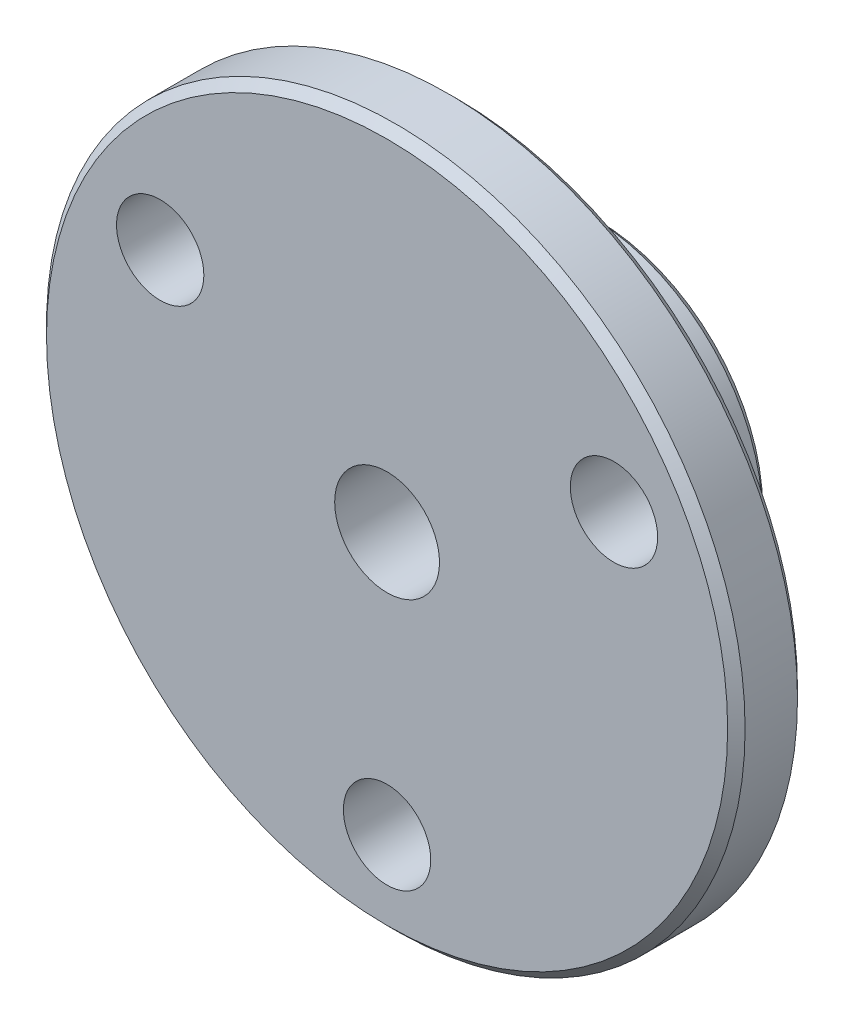
ISO-10303-21;
HEADER;
FILE_DESCRIPTION(('STEP AP214'),'2;1');
FILE_NAME('part.step','',(''),(''),'','','');
FILE_SCHEMA(('AUTOMOTIVE_DESIGN { 1 0 10303 214 1 1 1 1 }'));
ENDSEC;
DATA;
#1=APPLICATION_CONTEXT('core data for automotive mechanical design processes');
#2=APPLICATION_PROTOCOL_DEFINITION('international standard','automotive_design',2000,#1);
#3=PRODUCT_CONTEXT('',#1,'mechanical');
#4=PRODUCT('Part','Part','',(#3));
#5=PRODUCT_RELATED_PRODUCT_CATEGORY('part','',(#4));
#6=PRODUCT_DEFINITION_FORMATION('','',#4);
#7=PRODUCT_DEFINITION_CONTEXT('part definition',#1,'design');
#8=PRODUCT_DEFINITION('design','',#6,#7);
#9=PRODUCT_DEFINITION_SHAPE('','',#8);
#10=(LENGTH_UNIT() NAMED_UNIT(*) SI_UNIT(.MILLI.,.METRE.));
#11=(NAMED_UNIT(*) PLANE_ANGLE_UNIT() SI_UNIT($,.RADIAN.));
#12=(NAMED_UNIT(*) SI_UNIT($,.STERADIAN.) SOLID_ANGLE_UNIT());
#13=UNCERTAINTY_MEASURE_WITH_UNIT(LENGTH_MEASURE(1.E-05),#10,'distance_accuracy_value','');
#14=(GEOMETRIC_REPRESENTATION_CONTEXT(3) GLOBAL_UNCERTAINTY_ASSIGNED_CONTEXT((#13)) GLOBAL_UNIT_ASSIGNED_CONTEXT((#10,
#11,#12)) REPRESENTATION_CONTEXT('',''));
#15=CARTESIAN_POINT('',(0.,0.,0.));
#16=DIRECTION('',(0.,0.,1.));
#17=DIRECTION('',(1.,0.,0.));
#18=AXIS2_PLACEMENT_3D('',#15,#16,#17);
#19=CARTESIAN_POINT('',(0.,0.,-4.));
#20=DIRECTION('',(0.,0.,1.));
#21=DIRECTION('',(1.,0.,0.));
#22=AXIS2_PLACEMENT_3D('',#19,#20,#21);
#23=CYLINDRICAL_SURFACE('',#22,5.);
#24=CARTESIAN_POINT('',(0.,0.,-0.249999999999997));
#25=DIRECTION('',(0.,0.,1.));
#26=DIRECTION('',(1.,0.,0.));
#27=AXIS2_PLACEMENT_3D('',#24,#25,#26);
#28=CIRCLE('',#27,5.);
#29=CARTESIAN_POINT('',(5.,0.,-0.249999999999997));
#30=VERTEX_POINT('',#29);
#31=EDGE_CURVE('E52',#30,#30,#28,.F.);
#32=ORIENTED_EDGE('',*,*,#31,.T.);
#33=EDGE_LOOP('',(#32));
#34=FACE_BOUND('',#33,.T.);
#35=CARTESIAN_POINT('',(0.,0.,-3.75));
#36=DIRECTION('',(0.,0.,1.));
#37=DIRECTION('',(1.,0.,0.));
#38=AXIS2_PLACEMENT_3D('',#35,#36,#37);
#39=CIRCLE('',#38,5.);
#40=CARTESIAN_POINT('',(5.,0.,-3.75));
#41=VERTEX_POINT('',#40);
#42=EDGE_CURVE('E57',#41,#41,#39,.T.);
#43=ORIENTED_EDGE('',*,*,#42,.T.);
#44=EDGE_LOOP('',(#43));
#45=FACE_BOUND('',#44,.T.);
#46=ADVANCED_FACE('F43',(#34,#45),#23,.T.);
#47=CARTESIAN_POINT('',(0.,0.,-4.));
#48=DIRECTION('',(0.,0.,1.));
#49=DIRECTION('',(1.,0.,0.));
#50=AXIS2_PLACEMENT_3D('',#47,#48,#49);
#51=PLANE('',#50);
#52=CARTESIAN_POINT('',(0.,0.,-4.));
#53=DIRECTION('',(0.,0.,1.));
#54=DIRECTION('',(1.,0.,0.));
#55=AXIS2_PLACEMENT_3D('',#52,#53,#54);
#56=CIRCLE('',#55,4.75);
#57=CARTESIAN_POINT('',(4.75,0.,-4.));
#58=VERTEX_POINT('',#57);
#59=EDGE_CURVE('E10',#58,#58,#56,.F.);
#60=ORIENTED_EDGE('',*,*,#59,.T.);
#61=EDGE_LOOP('',(#60));
#62=FACE_BOUND('',#61,.T.);
#63=CARTESIAN_POINT('',(0.,0.,-4.));
#64=DIRECTION('',(0.,0.,-1.));
#65=DIRECTION('',(-1.,0.,0.));
#66=AXIS2_PLACEMENT_3D('',#63,#64,#65);
#67=CIRCLE('',#66,1.5);
#68=CARTESIAN_POINT('',(-1.5,0.,-4.));
#69=VERTEX_POINT('',#68);
#70=EDGE_CURVE('E109',#69,#69,#67,.T.);
#71=ORIENTED_EDGE('',*,*,#70,.F.);
#72=EDGE_LOOP('',(#71));
#73=FACE_BOUND('',#72,.T.);
#74=ADVANCED_FACE('F128',(#62,#73),#51,.F.);
#75=CARTESIAN_POINT('',(0.,0.,2.));
#76=DIRECTION('',(0.,0.,1.));
#77=DIRECTION('',(1.,0.,0.));
#78=AXIS2_PLACEMENT_3D('',#75,#76,#77);
#79=PLANE('',#78);
#80=CARTESIAN_POINT('',(0.,0.,2.));
#81=DIRECTION('',(0.,0.,1.));
#82=DIRECTION('',(1.,0.,0.));
#83=AXIS2_PLACEMENT_3D('',#80,#81,#82);
#84=CIRCLE('',#83,9.75000000000001);
#85=CARTESIAN_POINT('',(9.75000000000001,0.,2.));
#86=VERTEX_POINT('',#85);
#87=EDGE_CURVE('E80',#86,#86,#84,.T.);
#88=ORIENTED_EDGE('',*,*,#87,.T.);
#89=EDGE_LOOP('',(#88));
#90=FACE_BOUND('',#89,.T.);
#91=CARTESIAN_POINT('',(0.,0.,2.));
#92=DIRECTION('',(0.,0.,-1.));
#93=DIRECTION('',(-1.,0.,0.));
#94=AXIS2_PLACEMENT_3D('',#91,#92,#93);
#95=CIRCLE('',#94,1.5);
#96=CARTESIAN_POINT('',(-1.5,0.,2.));
#97=VERTEX_POINT('',#96);
#98=EDGE_CURVE('E105',#97,#97,#95,.T.);
#99=ORIENTED_EDGE('',*,*,#98,.T.);
#100=EDGE_LOOP('',(#99));
#101=FACE_BOUND('',#100,.T.);
#102=CARTESIAN_POINT('',(6.49519052838293,3.75000000000023,2.));
#103=DIRECTION('',(0.,0.,1.));
#104=DIRECTION('',(1.,0.,0.));
#105=AXIS2_PLACEMENT_3D('',#102,#103,#104);
#106=CIRCLE('',#105,1.25000000000019);
#107=CARTESIAN_POINT('',(7.74519052838312,3.75000000000023,2.));
#108=VERTEX_POINT('',#107);
#109=EDGE_CURVE('E89',#108,#108,#106,.T.);
#110=ORIENTED_EDGE('',*,*,#109,.F.);
#111=EDGE_LOOP('',(#110));
#112=FACE_BOUND('',#111,.T.);
#113=CARTESIAN_POINT('',(-6.49519052838327,3.75000000000003,2.));
#114=DIRECTION('',(0.,0.,1.));
#115=DIRECTION('',(1.,0.,0.));
#116=AXIS2_PLACEMENT_3D('',#113,#114,#115);
#117=CIRCLE('',#116,1.25);
#118=CARTESIAN_POINT('',(-5.24519052838327,3.75000000000003,2.));
#119=VERTEX_POINT('',#118);
#120=EDGE_CURVE('E84',#119,#119,#117,.T.);
#121=ORIENTED_EDGE('',*,*,#120,.F.);
#122=EDGE_LOOP('',(#121));
#123=FACE_BOUND('',#122,.T.);
#124=CARTESIAN_POINT('',(0.,-7.49999999999954,2.));
#125=DIRECTION('',(0.,0.,1.));
#126=DIRECTION('',(1.,0.,0.));
#127=AXIS2_PLACEMENT_3D('',#124,#125,#126);
#128=CIRCLE('',#127,1.24999999999977);
#129=CARTESIAN_POINT('',(1.24999999999977,-7.49999999999954,2.));
#130=VERTEX_POINT('',#129);
#131=EDGE_CURVE('E97',#130,#130,#128,.T.);
#132=ORIENTED_EDGE('',*,*,#131,.F.);
#133=EDGE_LOOP('',(#132));
#134=FACE_BOUND('',#133,.T.);
#135=ADVANCED_FACE('F117',(#90,#101,#112,#123,#134),#79,.T.);
#136=CARTESIAN_POINT('',(0.,0.,0.));
#137=DIRECTION('',(0.,0.,1.));
#138=DIRECTION('',(1.,0.,0.));
#139=AXIS2_PLACEMENT_3D('',#136,#137,#138);
#140=PLANE('',#139);
#141=CARTESIAN_POINT('',(0.,0.,0.));
#142=DIRECTION('',(0.,0.,1.));
#143=DIRECTION('',(1.,0.,0.));
#144=AXIS2_PLACEMENT_3D('',#141,#142,#143);
#145=CIRCLE('',#144,9.75);
#146=CARTESIAN_POINT('',(9.75,0.,0.));
#147=VERTEX_POINT('',#146);
#148=EDGE_CURVE('E62',#147,#147,#145,.F.);
#149=ORIENTED_EDGE('',*,*,#148,.T.);
#150=EDGE_LOOP('',(#149));
#151=FACE_BOUND('',#150,.T.);
#152=CARTESIAN_POINT('',(0.,0.,0.));
#153=DIRECTION('',(0.,0.,1.));
#154=DIRECTION('',(1.,0.,0.));
#155=AXIS2_PLACEMENT_3D('',#152,#153,#154);
#156=CIRCLE('',#155,5.25);
#157=CARTESIAN_POINT('',(5.25,0.,0.));
#158=VERTEX_POINT('',#157);
#159=EDGE_CURVE('E68',#158,#158,#156,.T.);
#160=ORIENTED_EDGE('',*,*,#159,.T.);
#161=EDGE_LOOP('',(#160));
#162=FACE_BOUND('',#161,.T.);
#163=CARTESIAN_POINT('',(-6.49519052838327,3.75000000000003,0.));
#164=DIRECTION('',(0.,0.,1.));
#165=DIRECTION('',(1.,0.,0.));
#166=AXIS2_PLACEMENT_3D('',#163,#164,#165);
#167=CIRCLE('',#166,1.25);
#168=CARTESIAN_POINT('',(-5.24519052838327,3.75000000000003,0.));
#169=VERTEX_POINT('',#168);
#170=EDGE_CURVE('E85',#169,#169,#167,.T.);
#171=ORIENTED_EDGE('',*,*,#170,.T.);
#172=EDGE_LOOP('',(#171));
#173=FACE_BOUND('',#172,.T.);
#174=CARTESIAN_POINT('',(6.49519052838293,3.75000000000023,0.));
#175=DIRECTION('',(0.,0.,1.));
#176=DIRECTION('',(1.,0.,0.));
#177=AXIS2_PLACEMENT_3D('',#174,#175,#176);
#178=CIRCLE('',#177,1.25000000000019);
#179=CARTESIAN_POINT('',(7.74519052838312,3.75000000000023,0.));
#180=VERTEX_POINT('',#179);
#181=EDGE_CURVE('E93',#180,#180,#178,.T.);
#182=ORIENTED_EDGE('',*,*,#181,.T.);
#183=EDGE_LOOP('',(#182));
#184=FACE_BOUND('',#183,.T.);
#185=CARTESIAN_POINT('',(0.,-7.49999999999954,0.));
#186=DIRECTION('',(0.,0.,1.));
#187=DIRECTION('',(1.,0.,0.));
#188=AXIS2_PLACEMENT_3D('',#185,#186,#187);
#189=CIRCLE('',#188,1.24999999999977);
#190=CARTESIAN_POINT('',(1.24999999999977,-7.49999999999954,0.));
#191=VERTEX_POINT('',#190);
#192=EDGE_CURVE('E101',#191,#191,#189,.T.);
#193=ORIENTED_EDGE('',*,*,#192,.T.);
#194=EDGE_LOOP('',(#193));
#195=FACE_BOUND('',#194,.T.);
#196=ADVANCED_FACE('F135',(#151,#162,#173,#184,#195),#140,.F.);
#197=CARTESIAN_POINT('',(0.,0.,2.));
#198=DIRECTION('',(0.,0.,-1.));
#199=DIRECTION('',(-1.,0.,0.));
#200=AXIS2_PLACEMENT_3D('',#197,#198,#199);
#201=CYLINDRICAL_SURFACE('',#200,10.);
#202=CARTESIAN_POINT('',(0.,0.,1.75000000000001));
#203=DIRECTION('',(0.,0.,1.));
#204=DIRECTION('',(1.,0.,0.));
#205=AXIS2_PLACEMENT_3D('',#202,#203,#204);
#206=CIRCLE('',#205,10.);
#207=CARTESIAN_POINT('',(10.,0.,1.75000000000001));
#208=VERTEX_POINT('',#207);
#209=EDGE_CURVE('E72',#208,#208,#206,.F.);
#210=ORIENTED_EDGE('',*,*,#209,.T.);
#211=EDGE_LOOP('',(#210));
#212=FACE_BOUND('',#211,.T.);
#213=CARTESIAN_POINT('',(0.,0.,0.250000000000002));
#214=DIRECTION('',(0.,0.,1.));
#215=DIRECTION('',(1.,0.,0.));
#216=AXIS2_PLACEMENT_3D('',#213,#214,#215);
#217=CIRCLE('',#216,10.);
#218=CARTESIAN_POINT('',(10.,0.,0.250000000000002));
#219=VERTEX_POINT('',#218);
#220=EDGE_CURVE('E76',#219,#219,#217,.T.);
#221=ORIENTED_EDGE('',*,*,#220,.T.);
#222=EDGE_LOOP('',(#221));
#223=FACE_BOUND('',#222,.T.);
#224=ADVANCED_FACE('F140',(#212,#223),#201,.T.);
#225=CARTESIAN_POINT('',(-6.49519052838327,3.75000000000003,2.));
#226=DIRECTION('',(0.,0.,-1.));
#227=DIRECTION('',(-1.,0.,0.));
#228=AXIS2_PLACEMENT_3D('',#225,#226,#227);
#229=CYLINDRICAL_SURFACE('',#228,1.25);
#230=ORIENTED_EDGE('',*,*,#120,.T.);
#231=EDGE_LOOP('',(#230));
#232=FACE_BOUND('',#231,.T.);
#233=ORIENTED_EDGE('',*,*,#170,.F.);
#234=EDGE_LOOP('',(#233));
#235=FACE_BOUND('',#234,.T.);
#236=ADVANCED_FACE('F184',(#232,#235),#229,.F.);
#237=CARTESIAN_POINT('',(6.49519052838293,3.75000000000023,2.));
#238=DIRECTION('',(0.,0.,-1.));
#239=DIRECTION('',(-1.,0.,0.));
#240=AXIS2_PLACEMENT_3D('',#237,#238,#239);
#241=CYLINDRICAL_SURFACE('',#240,1.25000000000019);
#242=ORIENTED_EDGE('',*,*,#109,.T.);
#243=EDGE_LOOP('',(#242));
#244=FACE_BOUND('',#243,.T.);
#245=ORIENTED_EDGE('',*,*,#181,.F.);
#246=EDGE_LOOP('',(#245));
#247=FACE_BOUND('',#246,.T.);
#248=ADVANCED_FACE('F178',(#244,#247),#241,.F.);
#249=CARTESIAN_POINT('',(0.,-7.49999999999954,2.));
#250=DIRECTION('',(0.,0.,-1.));
#251=DIRECTION('',(-1.,0.,0.));
#252=AXIS2_PLACEMENT_3D('',#249,#250,#251);
#253=CYLINDRICAL_SURFACE('',#252,1.24999999999977);
#254=ORIENTED_EDGE('',*,*,#131,.T.);
#255=EDGE_LOOP('',(#254));
#256=FACE_BOUND('',#255,.T.);
#257=ORIENTED_EDGE('',*,*,#192,.F.);
#258=EDGE_LOOP('',(#257));
#259=FACE_BOUND('',#258,.T.);
#260=ADVANCED_FACE('F124',(#256,#259),#253,.F.);
#261=CARTESIAN_POINT('',(0.,0.,2.));
#262=DIRECTION('',(0.,0.,-1.));
#263=DIRECTION('',(-1.,0.,0.));
#264=AXIS2_PLACEMENT_3D('',#261,#262,#263);
#265=CYLINDRICAL_SURFACE('',#264,1.5);
#266=ORIENTED_EDGE('',*,*,#98,.F.);
#267=EDGE_LOOP('',(#266));
#268=FACE_BOUND('',#267,.T.);
#269=ORIENTED_EDGE('',*,*,#70,.T.);
#270=EDGE_LOOP('',(#269));
#271=FACE_BOUND('',#270,.T.);
#272=ADVANCED_FACE('F120',(#268,#271),#265,.F.);
#273=CARTESIAN_POINT('',(0.,0.,2.));
#274=DIRECTION('',(0.,0.,-1.));
#275=DIRECTION('',(-1.,0.,0.));
#276=AXIS2_PLACEMENT_3D('',#273,#274,#275);
#277=CONICAL_SURFACE('',#276,9.75000000000001,0.785398163397441);
#278=ORIENTED_EDGE('',*,*,#209,.F.);
#279=EDGE_LOOP('',(#278));
#280=FACE_BOUND('',#279,.T.);
#281=ORIENTED_EDGE('',*,*,#87,.F.);
#282=EDGE_LOOP('',(#281));
#283=FACE_BOUND('',#282,.T.);
#284=ADVANCED_FACE('F123',(#280,#283),#277,.T.);
#285=CARTESIAN_POINT('',(0.,0.,0.250000000000002));
#286=DIRECTION('',(0.,0.,1.));
#287=DIRECTION('',(1.,0.,0.));
#288=AXIS2_PLACEMENT_3D('',#285,#286,#287);
#289=CONICAL_SURFACE('',#288,10.,0.785398163397445);
#290=ORIENTED_EDGE('',*,*,#148,.F.);
#291=EDGE_LOOP('',(#290));
#292=FACE_BOUND('',#291,.T.);
#293=ORIENTED_EDGE('',*,*,#220,.F.);
#294=EDGE_LOOP('',(#293));
#295=FACE_BOUND('',#294,.T.);
#296=ADVANCED_FACE('F149',(#292,#295),#289,.T.);
#297=CARTESIAN_POINT('',(0.,0.,0.));
#298=DIRECTION('',(0.,0.,1.));
#299=DIRECTION('',(1.,0.,0.));
#300=AXIS2_PLACEMENT_3D('',#297,#298,#299);
#301=CONICAL_SURFACE('',#300,5.25,0.785398163397455);
#302=ORIENTED_EDGE('',*,*,#31,.F.);
#303=EDGE_LOOP('',(#302));
#304=FACE_BOUND('',#303,.T.);
#305=ORIENTED_EDGE('',*,*,#159,.F.);
#306=EDGE_LOOP('',(#305));
#307=FACE_BOUND('',#306,.T.);
#308=ADVANCED_FACE('F155',(#304,#307),#301,.T.);
#309=CARTESIAN_POINT('',(0.,0.,-3.75));
#310=DIRECTION('',(0.,0.,1.));
#311=DIRECTION('',(1.,0.,0.));
#312=AXIS2_PLACEMENT_3D('',#309,#310,#311);
#313=CONICAL_SURFACE('',#312,5.,0.785398163397448);
#314=ORIENTED_EDGE('',*,*,#59,.F.);
#315=EDGE_LOOP('',(#314));
#316=FACE_BOUND('',#315,.T.);
#317=ORIENTED_EDGE('',*,*,#42,.F.);
#318=EDGE_LOOP('',(#317));
#319=FACE_BOUND('',#318,.T.);
#320=ADVANCED_FACE('F46',(#316,#319),#313,.T.);
#321=CLOSED_SHELL('',(#46,#74,#135,#196,#224,#236,#248,#260,#272,#284,#296,#308,#320));
#322=MANIFOLD_SOLID_BREP('B2',#321);
#323=ADVANCED_BREP_SHAPE_REPRESENTATION('',(#18,#322),#14);
#324=SHAPE_DEFINITION_REPRESENTATION(#9,#323);
ENDSEC;
END-ISO-10303-21;
